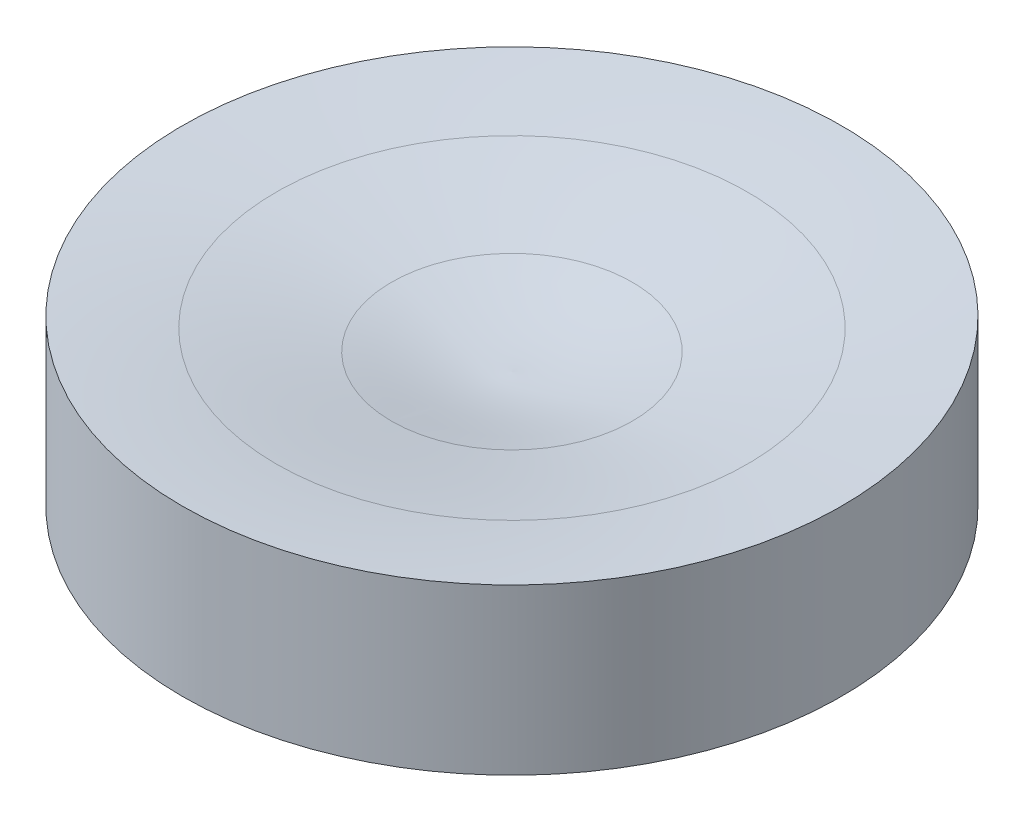
ISO-10303-21;
HEADER;
FILE_DESCRIPTION(('STEP AP214'),'2;1');
FILE_NAME('part.step','',(''),(''),'','','');
FILE_SCHEMA(('AUTOMOTIVE_DESIGN { 1 0 10303 214 1 1 1 1 }'));
ENDSEC;
DATA;
#1=APPLICATION_CONTEXT('core data for automotive mechanical design processes');
#2=APPLICATION_PROTOCOL_DEFINITION('international standard','automotive_design',2000,#1);
#3=PRODUCT_CONTEXT('',#1,'mechanical');
#4=PRODUCT('Part','Part','',(#3));
#5=PRODUCT_RELATED_PRODUCT_CATEGORY('part','',(#4));
#6=PRODUCT_DEFINITION_FORMATION('','',#4);
#7=PRODUCT_DEFINITION_CONTEXT('part definition',#1,'design');
#8=PRODUCT_DEFINITION('design','',#6,#7);
#9=PRODUCT_DEFINITION_SHAPE('','',#8);
#10=(LENGTH_UNIT() NAMED_UNIT(*) SI_UNIT(.MILLI.,.METRE.));
#11=(NAMED_UNIT(*) PLANE_ANGLE_UNIT() SI_UNIT($,.RADIAN.));
#12=(NAMED_UNIT(*) SI_UNIT($,.STERADIAN.) SOLID_ANGLE_UNIT());
#13=UNCERTAINTY_MEASURE_WITH_UNIT(LENGTH_MEASURE(1.E-05),#10,'distance_accuracy_value','');
#14=(GEOMETRIC_REPRESENTATION_CONTEXT(3) GLOBAL_UNCERTAINTY_ASSIGNED_CONTEXT((#13)) GLOBAL_UNIT_ASSIGNED_CONTEXT((#10,
#11,#12)) REPRESENTATION_CONTEXT('',''));
#15=CARTESIAN_POINT('',(0.,0.,0.));
#16=DIRECTION('',(0.,0.,1.));
#17=DIRECTION('',(1.,0.,0.));
#18=AXIS2_PLACEMENT_3D('',#15,#16,#17);
#19=CARTESIAN_POINT('',(0.,2.,4.));
#20=CARTESIAN_POINT('',(0.,1.92421980225379,3.14517533851381));
#21=CARTESIAN_POINT('',(0.,1.74510242478651,1.81369185664902));
#22=CARTESIAN_POINT('',(0.,1.38463265193194,0.495630569757458));
#23=CARTESIAN_POINT('',(0.,1.40988148238145,0.));
#24=B_SPLINE_CURVE_WITH_KNOTS('',3,(#19,#20,#21,#22,#23),.UNSPECIFIED.,.F.,.F.,(4,1,4),(0.,
0.634297274829479,1.),.UNSPECIFIED.);
#25=CARTESIAN_POINT('',(0.,1.40988148238145,0.));
#26=DIRECTION('',(0.,1.,0.));
#27=AXIS1_PLACEMENT('',#25,#26);
#28=SURFACE_OF_REVOLUTION('',#24,#27);
#29=CARTESIAN_POINT('',(0.,1.87260404806899,0.));
#30=DIRECTION('',(0.,1.,0.));
#31=DIRECTION('',(0.,0.,1.));
#32=AXIS2_PLACEMENT_3D('',#29,#30,#31);
#33=CIRCLE('',#32,2.85970078339635);
#34=CARTESIAN_POINT('',(0.,1.87260404806899,2.85970078339635));
#35=VERTEX_POINT('',#34);
#36=EDGE_CURVE('E53',#35,#35,#33,.T.);
#37=ORIENTED_EDGE('',*,*,#36,.F.);
#38=EDGE_LOOP('',(#37));
#39=FACE_BOUND('',#38,.T.);
#40=CARTESIAN_POINT('',(0.,2.,0.));
#41=DIRECTION('',(0.,1.,0.));
#42=DIRECTION('',(0.,0.,1.));
#43=AXIS2_PLACEMENT_3D('',#40,#41,#42);
#44=CIRCLE('',#43,4.);
#45=CARTESIAN_POINT('',(0.,2.,4.));
#46=VERTEX_POINT('',#45);
#47=EDGE_CURVE('E11',#46,#46,#44,.T.);
#48=ORIENTED_EDGE('',*,*,#47,.T.);
#49=EDGE_LOOP('',(#48));
#50=FACE_BOUND('',#49,.T.);
#51=ADVANCED_FACE('F33',(#39,#50),#28,.T.);
#52=CARTESIAN_POINT('',(0.,1.40988148238145,0.));
#53=DIRECTION('',(0.,1.,0.));
#54=DIRECTION('',(0.,0.,1.));
#55=AXIS2_PLACEMENT_3D('',#52,#53,#54);
#56=CYLINDRICAL_SURFACE('',#55,4.);
#57=ORIENTED_EDGE('',*,*,#47,.F.);
#58=EDGE_LOOP('',(#57));
#59=FACE_BOUND('',#58,.T.);
#60=CARTESIAN_POINT('',(0.,0.,0.));
#61=DIRECTION('',(0.,1.,0.));
#62=DIRECTION('',(0.,0.,1.));
#63=AXIS2_PLACEMENT_3D('',#60,#61,#62);
#64=CIRCLE('',#63,4.);
#65=CARTESIAN_POINT('',(0.,0.,4.));
#66=VERTEX_POINT('',#65);
#67=EDGE_CURVE('E40',#66,#66,#64,.T.);
#68=ORIENTED_EDGE('',*,*,#67,.T.);
#69=EDGE_LOOP('',(#68));
#70=FACE_BOUND('',#69,.T.);
#71=ADVANCED_FACE('F73',(#59,#70),#56,.T.);
#72=CARTESIAN_POINT('',(0.,0.,0.));
#73=DIRECTION('',(0.,1.,0.));
#74=DIRECTION('',(0.,0.,1.));
#75=AXIS2_PLACEMENT_3D('',#72,#73,#74);
#76=PLANE('',#75);
#77=ORIENTED_EDGE('',*,*,#67,.F.);
#78=EDGE_LOOP('',(#77));
#79=FACE_BOUND('',#78,.T.);
#80=ADVANCED_FACE('F47',(#79),#76,.F.);
#81=CARTESIAN_POINT('',(0.,2.,4.));
#82=CARTESIAN_POINT('',(0.,1.92421980225379,3.14517533851381));
#83=CARTESIAN_POINT('',(0.,1.74510242478651,1.81369185664902));
#84=CARTESIAN_POINT('',(0.,1.38463265193194,0.495630569757458));
#85=CARTESIAN_POINT('',(0.,1.40988148238145,0.));
#86=B_SPLINE_CURVE_WITH_KNOTS('',3,(#81,#82,#83,#84,#85),.UNSPECIFIED.,.F.,.F.,(4,1,4),(0.,
0.634297274829479,1.),.UNSPECIFIED.);
#87=CARTESIAN_POINT('',(0.,1.40988148238145,0.));
#88=DIRECTION('',(0.,1.,0.));
#89=AXIS1_PLACEMENT('',#87,#88);
#90=SURFACE_OF_REVOLUTION('',#86,#89);
#91=CARTESIAN_POINT('',(0.,1.40988148238145,0.));
#92=VERTEX_POINT('',#91);
#93=VERTEX_LOOP('',#92);
#94=FACE_BOUND('',#93,.T.);
#95=CARTESIAN_POINT('',(0.,1.62402841419771,0.));
#96=DIRECTION('',(0.,1.,0.));
#97=DIRECTION('',(0.,0.,1.));
#98=AXIS2_PLACEMENT_3D('',#95,#96,#97);
#99=CIRCLE('',#98,1.46146284287037);
#100=CARTESIAN_POINT('',(0.,1.62402841419771,1.46146284287037));
#101=VERTEX_POINT('',#100);
#102=EDGE_CURVE('E51',#101,#101,#99,.T.);
#103=ORIENTED_EDGE('',*,*,#102,.T.);
#104=EDGE_LOOP('',(#103));
#105=FACE_BOUND('',#104,.T.);
#106=ADVANCED_FACE('F43',(#94,#105),#90,.T.);
#107=CARTESIAN_POINT('',(0.,2.,4.));
#108=CARTESIAN_POINT('',(0.,1.92036681897237,2.73468393156594));
#109=CARTESIAN_POINT('',(0.,1.60359290750071,1.50367417623208));
#110=CARTESIAN_POINT('',(0.,1.40988148238145,0.254835286786843));
#111=B_SPLINE_CURVE_WITH_KNOTS('',3,(#107,#108,#109,#110),.UNSPECIFIED.,.F.,.F.,(4,4),(0.,1.),.UNSPECIFIED.);
#112=CARTESIAN_POINT('',(0.,1.40988148238145,0.));
#113=DIRECTION('',(0.,1.,0.));
#114=AXIS1_PLACEMENT('',#112,#113);
#115=SURFACE_OF_REVOLUTION('',#111,#114);
#116=ORIENTED_EDGE('',*,*,#102,.F.);
#117=EDGE_LOOP('',(#116));
#118=FACE_BOUND('',#117,.T.);
#119=ORIENTED_EDGE('',*,*,#36,.T.);
#120=EDGE_LOOP('',(#119));
#121=FACE_BOUND('',#120,.T.);
#122=ADVANCED_FACE('F46',(#118,#121),#115,.T.);
#123=CLOSED_SHELL('',(#51,#71,#80,#106,#122));
#124=MANIFOLD_SOLID_BREP('B2',#123);
#125=ADVANCED_BREP_SHAPE_REPRESENTATION('',(#18,#124),#14);
#126=SHAPE_DEFINITION_REPRESENTATION(#9,#125);
ENDSEC;
END-ISO-10303-21;
